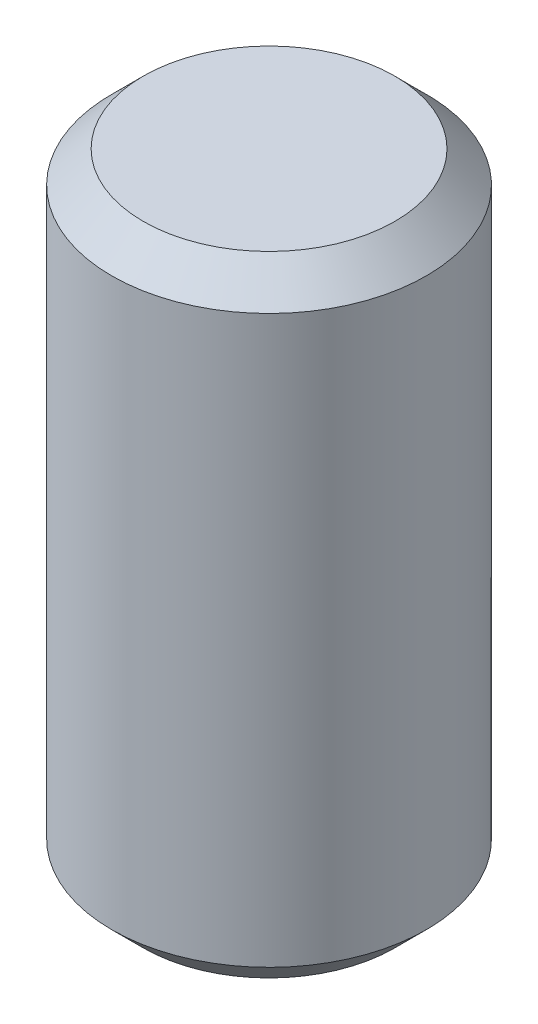
ISO-10303-21;
HEADER;
FILE_DESCRIPTION(('STEP AP214'),'2;1');
FILE_NAME('part.step','',(''),(''),'','','');
FILE_SCHEMA(('AUTOMOTIVE_DESIGN { 1 0 10303 214 1 1 1 1 }'));
ENDSEC;
DATA;
#1=APPLICATION_CONTEXT('core data for automotive mechanical design processes');
#2=APPLICATION_PROTOCOL_DEFINITION('international standard','automotive_design',2000,#1);
#3=PRODUCT_CONTEXT('',#1,'mechanical');
#4=PRODUCT('Part','Part','',(#3));
#5=PRODUCT_RELATED_PRODUCT_CATEGORY('part','',(#4));
#6=PRODUCT_DEFINITION_FORMATION('','',#4);
#7=PRODUCT_DEFINITION_CONTEXT('part definition',#1,'design');
#8=PRODUCT_DEFINITION('design','',#6,#7);
#9=PRODUCT_DEFINITION_SHAPE('','',#8);
#10=(LENGTH_UNIT() NAMED_UNIT(*) SI_UNIT(.MILLI.,.METRE.));
#11=(NAMED_UNIT(*) PLANE_ANGLE_UNIT() SI_UNIT($,.RADIAN.));
#12=(NAMED_UNIT(*) SI_UNIT($,.STERADIAN.) SOLID_ANGLE_UNIT());
#13=UNCERTAINTY_MEASURE_WITH_UNIT(LENGTH_MEASURE(1.E-05),#10,'distance_accuracy_value','');
#14=(GEOMETRIC_REPRESENTATION_CONTEXT(3) GLOBAL_UNCERTAINTY_ASSIGNED_CONTEXT((#13)) GLOBAL_UNIT_ASSIGNED_CONTEXT((#10,
#11,#12)) REPRESENTATION_CONTEXT('',''));
#15=CARTESIAN_POINT('',(0.,0.,0.));
#16=DIRECTION('',(0.,0.,1.));
#17=DIRECTION('',(1.,0.,0.));
#18=AXIS2_PLACEMENT_3D('',#15,#16,#17);
#19=CARTESIAN_POINT('',(-12.2504696950818,20.,-8.5444452495108));
#20=DIRECTION('',(0.,-1.,0.));
#21=DIRECTION('',(0.,0.,-1.));
#22=AXIS2_PLACEMENT_3D('',#19,#20,#21);
#23=CYLINDRICAL_SURFACE('',#22,5.);
#24=CARTESIAN_POINT('',(-12.2504696950818,0.999999999999997,-8.5444452495108));
#25=DIRECTION('',(0.,1.,0.));
#26=DIRECTION('',(0.,0.,1.));
#27=AXIS2_PLACEMENT_3D('',#24,#25,#26);
#28=CIRCLE('',#27,5.);
#29=CARTESIAN_POINT('',(-12.2504696950818,0.999999999999997,-3.5444452495108));
#30=VERTEX_POINT('',#29);
#31=EDGE_CURVE('E42',#30,#30,#28,.T.);
#32=ORIENTED_EDGE('',*,*,#31,.T.);
#33=EDGE_LOOP('',(#32));
#34=FACE_BOUND('',#33,.T.);
#35=CARTESIAN_POINT('',(-12.2504696950818,19.,-8.5444452495108));
#36=DIRECTION('',(0.,1.,0.));
#37=DIRECTION('',(0.,0.,1.));
#38=AXIS2_PLACEMENT_3D('',#35,#36,#37);
#39=CIRCLE('',#38,5.);
#40=CARTESIAN_POINT('',(-12.2504696950818,19.,-3.5444452495108));
#41=VERTEX_POINT('',#40);
#42=EDGE_CURVE('E46',#41,#41,#39,.F.);
#43=ORIENTED_EDGE('',*,*,#42,.T.);
#44=EDGE_LOOP('',(#43));
#45=FACE_BOUND('',#44,.T.);
#46=ADVANCED_FACE('F31',(#34,#45),#23,.T.);
#47=CARTESIAN_POINT('',(-12.2504696950818,20.,-8.5444452495108));
#48=DIRECTION('',(0.,1.,0.));
#49=DIRECTION('',(0.,0.,1.));
#50=AXIS2_PLACEMENT_3D('',#47,#48,#49);
#51=PLANE('',#50);
#52=CARTESIAN_POINT('',(-12.2504696950818,20.,-8.5444452495108));
#53=DIRECTION('',(0.,1.,0.));
#54=DIRECTION('',(0.,0.,1.));
#55=AXIS2_PLACEMENT_3D('',#52,#53,#54);
#56=CIRCLE('',#55,3.99999999999999);
#57=CARTESIAN_POINT('',(-12.2504696950818,20.,-4.5444452495108));
#58=VERTEX_POINT('',#57);
#59=EDGE_CURVE('E10',#58,#58,#56,.T.);
#60=ORIENTED_EDGE('',*,*,#59,.T.);
#61=EDGE_LOOP('',(#60));
#62=FACE_BOUND('',#61,.T.);
#63=ADVANCED_FACE('F62',(#62),#51,.T.);
#64=CARTESIAN_POINT('',(-12.2504696950818,0.,-8.5444452495108));
#65=DIRECTION('',(0.,1.,0.));
#66=DIRECTION('',(0.,0.,1.));
#67=AXIS2_PLACEMENT_3D('',#64,#65,#66);
#68=PLANE('',#67);
#69=CARTESIAN_POINT('',(-12.2504696950818,0.,-8.5444452495108));
#70=DIRECTION('',(0.,1.,0.));
#71=DIRECTION('',(0.,0.,1.));
#72=AXIS2_PLACEMENT_3D('',#69,#70,#71);
#73=CIRCLE('',#72,4.);
#74=CARTESIAN_POINT('',(-12.2504696950818,0.,-4.5444452495108));
#75=VERTEX_POINT('',#74);
#76=EDGE_CURVE('E38',#75,#75,#73,.F.);
#77=ORIENTED_EDGE('',*,*,#76,.T.);
#78=EDGE_LOOP('',(#77));
#79=FACE_BOUND('',#78,.T.);
#80=ADVANCED_FACE('F59',(#79),#68,.F.);
#81=CARTESIAN_POINT('',(-12.2504696950818,0.999999999999997,-8.5444452495108));
#82=DIRECTION('',(0.,1.,0.));
#83=DIRECTION('',(0.,0.,1.));
#84=AXIS2_PLACEMENT_3D('',#81,#82,#83);
#85=CONICAL_SURFACE('',#84,5.,0.785398163397451);
#86=ORIENTED_EDGE('',*,*,#76,.F.);
#87=EDGE_LOOP('',(#86));
#88=FACE_BOUND('',#87,.T.);
#89=ORIENTED_EDGE('',*,*,#31,.F.);
#90=EDGE_LOOP('',(#89));
#91=FACE_BOUND('',#90,.T.);
#92=ADVANCED_FACE('F55',(#88,#91),#85,.T.);
#93=CARTESIAN_POINT('',(-12.2504696950818,20.,-8.5444452495108));
#94=DIRECTION('',(0.,-1.,0.));
#95=DIRECTION('',(0.,0.,-1.));
#96=AXIS2_PLACEMENT_3D('',#93,#94,#95);
#97=CONICAL_SURFACE('',#96,3.99999999999999,0.785398163397447);
#98=ORIENTED_EDGE('',*,*,#42,.F.);
#99=EDGE_LOOP('',(#98));
#100=FACE_BOUND('',#99,.T.);
#101=ORIENTED_EDGE('',*,*,#59,.F.);
#102=EDGE_LOOP('',(#101));
#103=FACE_BOUND('',#102,.T.);
#104=ADVANCED_FACE('F33',(#100,#103),#97,.T.);
#105=CLOSED_SHELL('',(#46,#63,#80,#92,#104));
#106=MANIFOLD_SOLID_BREP('B2',#105);
#107=ADVANCED_BREP_SHAPE_REPRESENTATION('',(#18,#106),#14);
#108=SHAPE_DEFINITION_REPRESENTATION(#9,#107);
ENDSEC;
END-ISO-10303-21;
